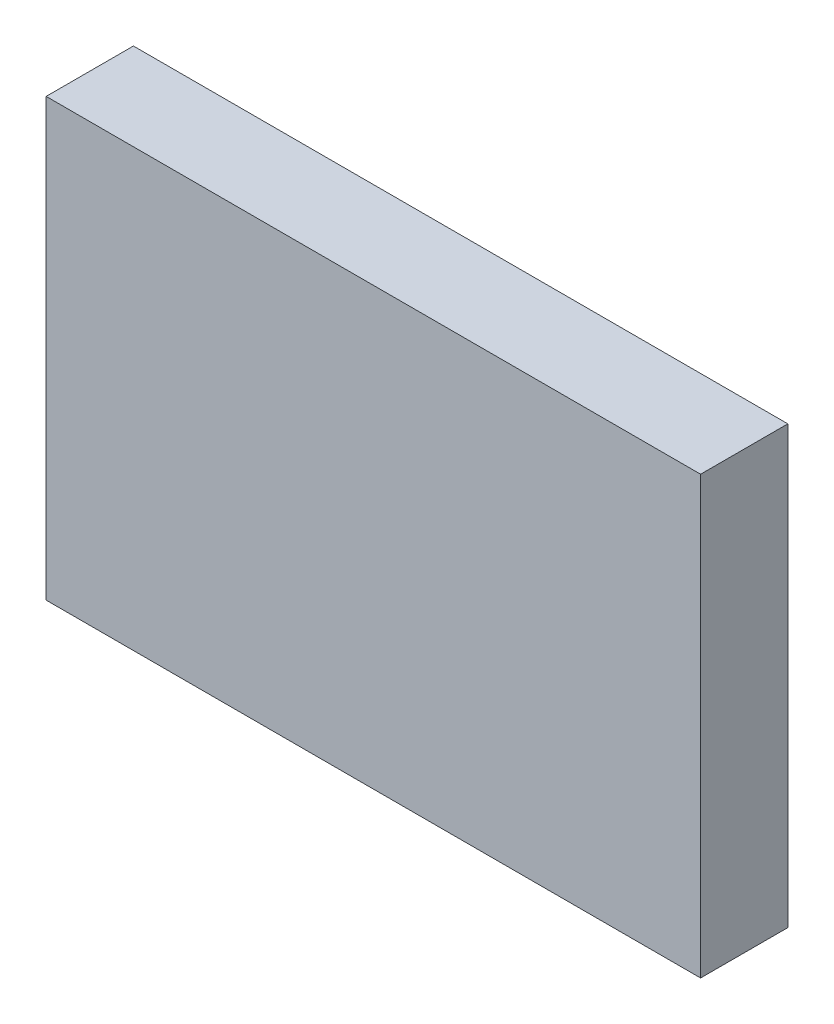
ISO-10303-21;
HEADER;
FILE_DESCRIPTION(('STEP AP214'),'2;1');
FILE_NAME('part.step','',(''),(''),'','','');
FILE_SCHEMA(('AUTOMOTIVE_DESIGN { 1 0 10303 214 1 1 1 1 }'));
ENDSEC;
DATA;
#1=APPLICATION_CONTEXT('core data for automotive mechanical design processes');
#2=APPLICATION_PROTOCOL_DEFINITION('international standard','automotive_design',2000,#1);
#3=PRODUCT_CONTEXT('',#1,'mechanical');
#4=PRODUCT('Part','Part','',(#3));
#5=PRODUCT_RELATED_PRODUCT_CATEGORY('part','',(#4));
#6=PRODUCT_DEFINITION_FORMATION('','',#4);
#7=PRODUCT_DEFINITION_CONTEXT('part definition',#1,'design');
#8=PRODUCT_DEFINITION('design','',#6,#7);
#9=PRODUCT_DEFINITION_SHAPE('','',#8);
#10=(LENGTH_UNIT() NAMED_UNIT(*) SI_UNIT(.MILLI.,.METRE.));
#11=(NAMED_UNIT(*) PLANE_ANGLE_UNIT() SI_UNIT($,.RADIAN.));
#12=(NAMED_UNIT(*) SI_UNIT($,.STERADIAN.) SOLID_ANGLE_UNIT());
#13=UNCERTAINTY_MEASURE_WITH_UNIT(LENGTH_MEASURE(1.E-05),#10,'distance_accuracy_value','');
#14=(GEOMETRIC_REPRESENTATION_CONTEXT(3) GLOBAL_UNCERTAINTY_ASSIGNED_CONTEXT((#13)) GLOBAL_UNIT_ASSIGNED_CONTEXT((#10,
#11,#12)) REPRESENTATION_CONTEXT('',''));
#15=CARTESIAN_POINT('',(0.,0.,0.));
#16=DIRECTION('',(0.,0.,1.));
#17=DIRECTION('',(1.,0.,0.));
#18=AXIS2_PLACEMENT_3D('',#15,#16,#17);
#19=CARTESIAN_POINT('',(-15.,-10.,-4.));
#20=DIRECTION('',(-1.,0.,0.));
#21=DIRECTION('',(0.,0.,1.));
#22=AXIS2_PLACEMENT_3D('',#19,#20,#21);
#23=PLANE('',#22);
#24=DIRECTION('',(0.,-1.,0.));
#25=VECTOR('',#24,1.);
#26=CARTESIAN_POINT('',(-15.,-10.,0.));
#27=LINE('',#26,#25);
#28=CARTESIAN_POINT('',(-15.,10.,0.));
#29=VERTEX_POINT('',#28);
#30=CARTESIAN_POINT('',(-15.,-10.,0.));
#31=VERTEX_POINT('',#30);
#32=EDGE_CURVE('E105',#29,#31,#27,.T.);
#33=ORIENTED_EDGE('',*,*,#32,.F.);
#34=DIRECTION('',(0.,0.,1.));
#35=VECTOR('',#34,1.);
#36=CARTESIAN_POINT('',(-15.,10.,-4.));
#37=LINE('',#36,#35);
#38=CARTESIAN_POINT('',(-15.,10.,-4.));
#39=VERTEX_POINT('',#38);
#40=EDGE_CURVE('E11',#39,#29,#37,.T.);
#41=ORIENTED_EDGE('',*,*,#40,.F.);
#42=DIRECTION('',(0.,-1.,0.));
#43=VECTOR('',#42,1.);
#44=CARTESIAN_POINT('',(-15.,-10.,-4.));
#45=LINE('',#44,#43);
#46=CARTESIAN_POINT('',(-15.,-10.,-4.));
#47=VERTEX_POINT('',#46);
#48=EDGE_CURVE('E99',#39,#47,#45,.T.);
#49=ORIENTED_EDGE('',*,*,#48,.T.);
#50=DIRECTION('',(0.,0.,1.));
#51=VECTOR('',#50,1.);
#52=CARTESIAN_POINT('',(-15.,-10.,-4.));
#53=LINE('',#52,#51);
#54=EDGE_CURVE('E44',#47,#31,#53,.T.);
#55=ORIENTED_EDGE('',*,*,#54,.T.);
#56=EDGE_LOOP('',(#33,#41,#49,#55));
#57=FACE_BOUND('',#56,.T.);
#58=ADVANCED_FACE('F41',(#57),#23,.T.);
#59=CARTESIAN_POINT('',(-15.,10.,-4.));
#60=DIRECTION('',(0.,1.,0.));
#61=DIRECTION('',(0.,0.,1.));
#62=AXIS2_PLACEMENT_3D('',#59,#60,#61);
#63=PLANE('',#62);
#64=DIRECTION('',(-1.,0.,0.));
#65=VECTOR('',#64,1.);
#66=CARTESIAN_POINT('',(-15.,10.,0.));
#67=LINE('',#66,#65);
#68=CARTESIAN_POINT('',(15.,10.,0.));
#69=VERTEX_POINT('',#68);
#70=EDGE_CURVE('E101',#69,#29,#67,.T.);
#71=ORIENTED_EDGE('',*,*,#70,.F.);
#72=DIRECTION('',(0.,0.,1.));
#73=VECTOR('',#72,1.);
#74=CARTESIAN_POINT('',(15.,10.,-4.));
#75=LINE('',#74,#73);
#76=CARTESIAN_POINT('',(15.,10.,-4.));
#77=VERTEX_POINT('',#76);
#78=EDGE_CURVE('E50',#77,#69,#75,.T.);
#79=ORIENTED_EDGE('',*,*,#78,.F.);
#80=DIRECTION('',(-1.,0.,0.));
#81=VECTOR('',#80,1.);
#82=CARTESIAN_POINT('',(-15.,10.,-4.));
#83=LINE('',#82,#81);
#84=EDGE_CURVE('E96',#77,#39,#83,.T.);
#85=ORIENTED_EDGE('',*,*,#84,.T.);
#86=ORIENTED_EDGE('',*,*,#40,.T.);
#87=EDGE_LOOP('',(#71,#79,#85,#86));
#88=FACE_BOUND('',#87,.T.);
#89=ADVANCED_FACE('F115',(#88),#63,.T.);
#90=CARTESIAN_POINT('',(15.,-10.,-4.));
#91=DIRECTION('',(1.,0.,0.));
#92=DIRECTION('',(0.,0.,-1.));
#93=AXIS2_PLACEMENT_3D('',#90,#91,#92);
#94=PLANE('',#93);
#95=DIRECTION('',(0.,1.,0.));
#96=VECTOR('',#95,1.);
#97=CARTESIAN_POINT('',(15.,-10.,0.));
#98=LINE('',#97,#96);
#99=CARTESIAN_POINT('',(15.,-10.,0.));
#100=VERTEX_POINT('',#99);
#101=EDGE_CURVE('E91',#100,#69,#98,.T.);
#102=ORIENTED_EDGE('',*,*,#101,.F.);
#103=DIRECTION('',(0.,0.,1.));
#104=VECTOR('',#103,1.);
#105=CARTESIAN_POINT('',(15.,-10.,-4.));
#106=LINE('',#105,#104);
#107=CARTESIAN_POINT('',(15.,-10.,-4.));
#108=VERTEX_POINT('',#107);
#109=EDGE_CURVE('E86',#108,#100,#106,.T.);
#110=ORIENTED_EDGE('',*,*,#109,.F.);
#111=DIRECTION('',(0.,1.,0.));
#112=VECTOR('',#111,1.);
#113=CARTESIAN_POINT('',(15.,-10.,-4.));
#114=LINE('',#113,#112);
#115=EDGE_CURVE('E89',#108,#77,#114,.T.);
#116=ORIENTED_EDGE('',*,*,#115,.T.);
#117=ORIENTED_EDGE('',*,*,#78,.T.);
#118=EDGE_LOOP('',(#102,#110,#116,#117));
#119=FACE_BOUND('',#118,.T.);
#120=ADVANCED_FACE('F88',(#119),#94,.T.);
#121=CARTESIAN_POINT('',(-15.,-10.,-4.));
#122=DIRECTION('',(0.,-1.,0.));
#123=DIRECTION('',(0.,0.,-1.));
#124=AXIS2_PLACEMENT_3D('',#121,#122,#123);
#125=PLANE('',#124);
#126=DIRECTION('',(1.,0.,0.));
#127=VECTOR('',#126,1.);
#128=CARTESIAN_POINT('',(-15.,-10.,0.));
#129=LINE('',#128,#127);
#130=EDGE_CURVE('E108',#31,#100,#129,.T.);
#131=ORIENTED_EDGE('',*,*,#130,.F.);
#132=ORIENTED_EDGE('',*,*,#54,.F.);
#133=DIRECTION('',(1.,0.,0.));
#134=VECTOR('',#133,1.);
#135=CARTESIAN_POINT('',(-15.,-10.,-4.));
#136=LINE('',#135,#134);
#137=EDGE_CURVE('E95',#47,#108,#136,.T.);
#138=ORIENTED_EDGE('',*,*,#137,.T.);
#139=ORIENTED_EDGE('',*,*,#109,.T.);
#140=EDGE_LOOP('',(#131,#132,#138,#139));
#141=FACE_BOUND('',#140,.T.);
#142=ADVANCED_FACE('F98',(#141),#125,.T.);
#143=CARTESIAN_POINT('',(0.,0.,-4.));
#144=DIRECTION('',(0.,0.,-1.));
#145=DIRECTION('',(-1.,0.,0.));
#146=AXIS2_PLACEMENT_3D('',#143,#144,#145);
#147=PLANE('',#146);
#148=ORIENTED_EDGE('',*,*,#48,.F.);
#149=ORIENTED_EDGE('',*,*,#84,.F.);
#150=ORIENTED_EDGE('',*,*,#115,.F.);
#151=ORIENTED_EDGE('',*,*,#137,.F.);
#152=EDGE_LOOP('',(#148,#149,#150,#151));
#153=FACE_BOUND('',#152,.T.);
#154=ADVANCED_FACE('F94',(#153),#147,.T.);
#155=CARTESIAN_POINT('',(0.,0.,0.));
#156=DIRECTION('',(0.,0.,-1.));
#157=DIRECTION('',(-1.,0.,0.));
#158=AXIS2_PLACEMENT_3D('',#155,#156,#157);
#159=PLANE('',#158);
#160=ORIENTED_EDGE('',*,*,#32,.T.);
#161=ORIENTED_EDGE('',*,*,#130,.T.);
#162=ORIENTED_EDGE('',*,*,#101,.T.);
#163=ORIENTED_EDGE('',*,*,#70,.T.);
#164=EDGE_LOOP('',(#160,#161,#162,#163));
#165=FACE_BOUND('',#164,.T.);
#166=ADVANCED_FACE('F114',(#165),#159,.F.);
#167=CLOSED_SHELL('',(#58,#89,#120,#142,#154,#166));
#168=MANIFOLD_SOLID_BREP('B2',#167);
#169=ADVANCED_BREP_SHAPE_REPRESENTATION('',(#18,#168),#14);
#170=SHAPE_DEFINITION_REPRESENTATION(#9,#169);
ENDSEC;
END-ISO-10303-21;
